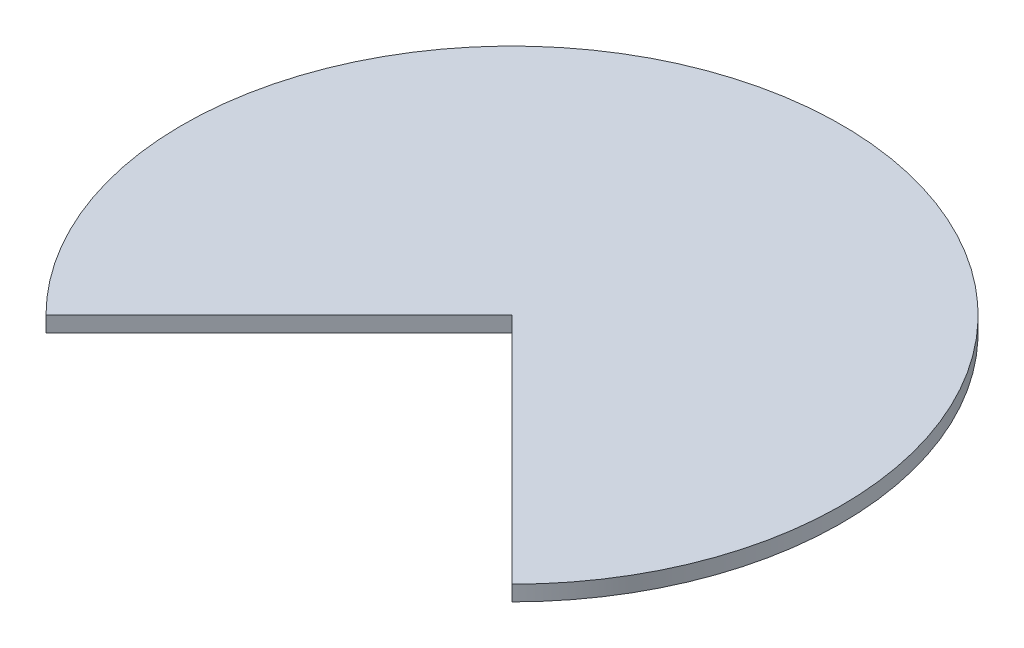
ISO-10303-21;
HEADER;
FILE_DESCRIPTION(('STEP AP214'),'2;1');
FILE_NAME('part.step','',(''),(''),'','','');
FILE_SCHEMA(('AUTOMOTIVE_DESIGN { 1 0 10303 214 1 1 1 1 }'));
ENDSEC;
DATA;
#1=APPLICATION_CONTEXT('core data for automotive mechanical design processes');
#2=APPLICATION_PROTOCOL_DEFINITION('international standard','automotive_design',2000,#1);
#3=PRODUCT_CONTEXT('',#1,'mechanical');
#4=PRODUCT('Part','Part','',(#3));
#5=PRODUCT_RELATED_PRODUCT_CATEGORY('part','',(#4));
#6=PRODUCT_DEFINITION_FORMATION('','',#4);
#7=PRODUCT_DEFINITION_CONTEXT('part definition',#1,'design');
#8=PRODUCT_DEFINITION('design','',#6,#7);
#9=PRODUCT_DEFINITION_SHAPE('','',#8);
#10=(LENGTH_UNIT() NAMED_UNIT(*) SI_UNIT(.MILLI.,.METRE.));
#11=(NAMED_UNIT(*) PLANE_ANGLE_UNIT() SI_UNIT($,.RADIAN.));
#12=(NAMED_UNIT(*) SI_UNIT($,.STERADIAN.) SOLID_ANGLE_UNIT());
#13=UNCERTAINTY_MEASURE_WITH_UNIT(LENGTH_MEASURE(1.E-05),#10,'distance_accuracy_value','');
#14=(GEOMETRIC_REPRESENTATION_CONTEXT(3) GLOBAL_UNCERTAINTY_ASSIGNED_CONTEXT((#13)) GLOBAL_UNIT_ASSIGNED_CONTEXT((#10,
#11,#12)) REPRESENTATION_CONTEXT('',''));
#15=CARTESIAN_POINT('',(0.,0.,0.));
#16=DIRECTION('',(0.,0.,1.));
#17=DIRECTION('',(1.,0.,0.));
#18=AXIS2_PLACEMENT_3D('',#15,#16,#17);
#19=CARTESIAN_POINT('',(0.,6.35,0.));
#20=DIRECTION('',(0.707106781186548,0.,-0.707106781186548));
#21=DIRECTION('',(-0.707106781186548,0.,-0.707106781186548));
#22=AXIS2_PLACEMENT_3D('',#19,#20,#21);
#23=PLANE('',#22);
#24=DIRECTION('',(0.707106781186547,0.,0.707106781186547));
#25=VECTOR('',#24,1.);
#26=CARTESIAN_POINT('',(0.,0.,0.));
#27=LINE('',#26,#25);
#28=CARTESIAN_POINT('',(0.,0.,0.));
#29=VERTEX_POINT('',#28);
#30=CARTESIAN_POINT('',(96.5167794752107,0.,96.5167794752107));
#31=VERTEX_POINT('',#30);
#32=EDGE_CURVE('E80',#29,#31,#27,.T.);
#33=ORIENTED_EDGE('',*,*,#32,.T.);
#34=DIRECTION('',(0.,-1.,0.));
#35=VECTOR('',#34,1.);
#36=CARTESIAN_POINT('',(96.5167794752107,6.35,96.5167794752107));
#37=LINE('',#36,#35);
#38=CARTESIAN_POINT('',(96.5167794752107,6.35,96.5167794752107));
#39=VERTEX_POINT('',#38);
#40=EDGE_CURVE('E11',#39,#31,#37,.T.);
#41=ORIENTED_EDGE('',*,*,#40,.F.);
#42=DIRECTION('',(0.707106781186547,0.,0.707106781186547));
#43=VECTOR('',#42,1.);
#44=CARTESIAN_POINT('',(0.,6.35,0.));
#45=LINE('',#44,#43);
#46=CARTESIAN_POINT('',(0.,6.35,0.));
#47=VERTEX_POINT('',#46);
#48=EDGE_CURVE('E73',#47,#39,#45,.T.);
#49=ORIENTED_EDGE('',*,*,#48,.F.);
#50=DIRECTION('',(0.,-1.,0.));
#51=VECTOR('',#50,1.);
#52=CARTESIAN_POINT('',(0.,6.35,0.));
#53=LINE('',#52,#51);
#54=EDGE_CURVE('E81',#47,#29,#53,.T.);
#55=ORIENTED_EDGE('',*,*,#54,.T.);
#56=EDGE_LOOP('',(#33,#41,#49,#55));
#57=FACE_BOUND('',#56,.T.);
#58=ADVANCED_FACE('F33',(#57),#23,.F.);
#59=CARTESIAN_POINT('',(0.,6.35,0.));
#60=DIRECTION('',(0.,-1.,0.));
#61=DIRECTION('',(0.,0.,-1.));
#62=AXIS2_PLACEMENT_3D('',#59,#60,#61);
#63=CYLINDRICAL_SURFACE('',#62,136.495338530416);
#64=CARTESIAN_POINT('',(0.,0.,0.));
#65=DIRECTION('',(0.,1.,0.));
#66=DIRECTION('',(0.,0.,1.));
#67=AXIS2_PLACEMENT_3D('',#64,#65,#66);
#68=CIRCLE('',#67,136.495338530416);
#69=CARTESIAN_POINT('',(-96.5167794752107,0.,96.5167794752107));
#70=VERTEX_POINT('',#69);
#71=EDGE_CURVE('E61',#31,#70,#68,.T.);
#72=ORIENTED_EDGE('',*,*,#71,.T.);
#73=DIRECTION('',(0.,-1.,0.));
#74=VECTOR('',#73,1.);
#75=CARTESIAN_POINT('',(-96.5167794752107,6.35,96.5167794752107));
#76=LINE('',#75,#74);
#77=CARTESIAN_POINT('',(-96.5167794752107,6.35,96.5167794752107));
#78=VERTEX_POINT('',#77);
#79=EDGE_CURVE('E41',#78,#70,#76,.T.);
#80=ORIENTED_EDGE('',*,*,#79,.F.);
#81=CARTESIAN_POINT('',(0.,6.35,0.));
#82=DIRECTION('',(0.,1.,0.));
#83=DIRECTION('',(0.,0.,1.));
#84=AXIS2_PLACEMENT_3D('',#81,#82,#83);
#85=CIRCLE('',#84,136.495338530416);
#86=EDGE_CURVE('E69',#39,#78,#85,.T.);
#87=ORIENTED_EDGE('',*,*,#86,.F.);
#88=ORIENTED_EDGE('',*,*,#40,.T.);
#89=EDGE_LOOP('',(#72,#80,#87,#88));
#90=FACE_BOUND('',#89,.T.);
#91=ADVANCED_FACE('F70',(#90),#63,.T.);
#92=CARTESIAN_POINT('',(0.,6.35,0.));
#93=DIRECTION('',(-0.707106781186548,0.,-0.707106781186548));
#94=DIRECTION('',(-0.707106781186548,0.,0.707106781186548));
#95=AXIS2_PLACEMENT_3D('',#92,#93,#94);
#96=PLANE('',#95);
#97=DIRECTION('',(0.707106781186547,0.,-0.707106781186547));
#98=VECTOR('',#97,1.);
#99=CARTESIAN_POINT('',(0.,0.,0.));
#100=LINE('',#99,#98);
#101=EDGE_CURVE('E66',#70,#29,#100,.T.);
#102=ORIENTED_EDGE('',*,*,#101,.T.);
#103=ORIENTED_EDGE('',*,*,#54,.F.);
#104=DIRECTION('',(0.707106781186547,0.,-0.707106781186547));
#105=VECTOR('',#104,1.);
#106=CARTESIAN_POINT('',(0.,6.35,0.));
#107=LINE('',#106,#105);
#108=EDGE_CURVE('E49',#78,#47,#107,.T.);
#109=ORIENTED_EDGE('',*,*,#108,.F.);
#110=ORIENTED_EDGE('',*,*,#79,.T.);
#111=EDGE_LOOP('',(#102,#103,#109,#110));
#112=FACE_BOUND('',#111,.T.);
#113=ADVANCED_FACE('F88',(#112),#96,.F.);
#114=CARTESIAN_POINT('',(0.,6.35,0.));
#115=DIRECTION('',(0.,1.,0.));
#116=DIRECTION('',(0.,0.,1.));
#117=AXIS2_PLACEMENT_3D('',#114,#115,#116);
#118=PLANE('',#117);
#119=ORIENTED_EDGE('',*,*,#48,.T.);
#120=ORIENTED_EDGE('',*,*,#86,.T.);
#121=ORIENTED_EDGE('',*,*,#108,.T.);
#122=EDGE_LOOP('',(#119,#120,#121));
#123=FACE_BOUND('',#122,.T.);
#124=ADVANCED_FACE('F76',(#123),#118,.T.);
#125=CARTESIAN_POINT('',(0.,0.,0.));
#126=DIRECTION('',(0.,1.,0.));
#127=DIRECTION('',(0.,0.,1.));
#128=AXIS2_PLACEMENT_3D('',#125,#126,#127);
#129=PLANE('',#128);
#130=ORIENTED_EDGE('',*,*,#32,.F.);
#131=ORIENTED_EDGE('',*,*,#101,.F.);
#132=ORIENTED_EDGE('',*,*,#71,.F.);
#133=EDGE_LOOP('',(#130,#131,#132));
#134=FACE_BOUND('',#133,.T.);
#135=ADVANCED_FACE('F89',(#134),#129,.F.);
#136=CLOSED_SHELL('',(#58,#91,#113,#124,#135));
#137=MANIFOLD_SOLID_BREP('B2',#136);
#138=ADVANCED_BREP_SHAPE_REPRESENTATION('',(#18,#137),#14);
#139=SHAPE_DEFINITION_REPRESENTATION(#9,#138);
ENDSEC;
END-ISO-10303-21;
